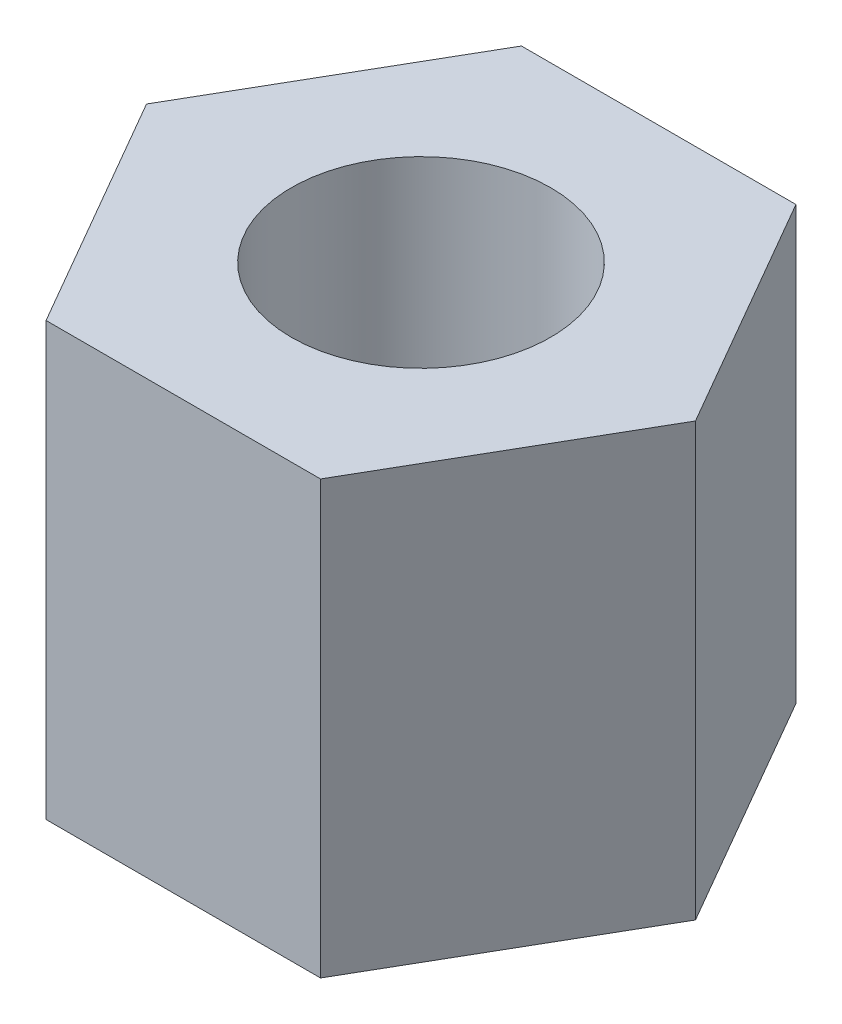
ISO-10303-21;
HEADER;
FILE_DESCRIPTION(('STEP AP214'),'2;1');
FILE_NAME('part.step','',(''),(''),'','','');
FILE_SCHEMA(('AUTOMOTIVE_DESIGN { 1 0 10303 214 1 1 1 1 }'));
ENDSEC;
DATA;
#1=APPLICATION_CONTEXT('core data for automotive mechanical design processes');
#2=APPLICATION_PROTOCOL_DEFINITION('international standard','automotive_design',2000,#1);
#3=PRODUCT_CONTEXT('',#1,'mechanical');
#4=PRODUCT('Part','Part','',(#3));
#5=PRODUCT_RELATED_PRODUCT_CATEGORY('part','',(#4));
#6=PRODUCT_DEFINITION_FORMATION('','',#4);
#7=PRODUCT_DEFINITION_CONTEXT('part definition',#1,'design');
#8=PRODUCT_DEFINITION('design','',#6,#7);
#9=PRODUCT_DEFINITION_SHAPE('','',#8);
#10=(LENGTH_UNIT() NAMED_UNIT(*) SI_UNIT(.MILLI.,.METRE.));
#11=(NAMED_UNIT(*) PLANE_ANGLE_UNIT() SI_UNIT($,.RADIAN.));
#12=(NAMED_UNIT(*) SI_UNIT($,.STERADIAN.) SOLID_ANGLE_UNIT());
#13=UNCERTAINTY_MEASURE_WITH_UNIT(LENGTH_MEASURE(1.E-05),#10,'distance_accuracy_value','');
#14=(GEOMETRIC_REPRESENTATION_CONTEXT(3) GLOBAL_UNCERTAINTY_ASSIGNED_CONTEXT((#13)) GLOBAL_UNIT_ASSIGNED_CONTEXT((#10,
#11,#12)) REPRESENTATION_CONTEXT('',''));
#15=CARTESIAN_POINT('',(0.,0.,0.));
#16=DIRECTION('',(0.,0.,1.));
#17=DIRECTION('',(1.,0.,0.));
#18=AXIS2_PLACEMENT_3D('',#15,#16,#17);
#19=CARTESIAN_POINT('',(0.,5.,0.));
#20=DIRECTION('',(0.,1.,0.));
#21=DIRECTION('',(0.,0.,1.));
#22=AXIS2_PLACEMENT_3D('',#19,#20,#21);
#23=PLANE('',#22);
#24=DIRECTION('',(-0.5,0.,-0.866025403784438));
#25=VECTOR('',#24,1.);
#26=CARTESIAN_POINT('',(3.17542648054294,5.,0.));
#27=LINE('',#26,#25);
#28=CARTESIAN_POINT('',(3.17542648054294,5.,0.));
#29=VERTEX_POINT('',#28);
#30=CARTESIAN_POINT('',(1.58771324027147,5.,-2.75));
#31=VERTEX_POINT('',#30);
#32=EDGE_CURVE('E128',#29,#31,#27,.T.);
#33=ORIENTED_EDGE('',*,*,#32,.T.);
#34=DIRECTION('',(-1.,0.,0.));
#35=VECTOR('',#34,1.);
#36=CARTESIAN_POINT('',(1.58771324027147,5.,-2.75));
#37=LINE('',#36,#35);
#38=CARTESIAN_POINT('',(-1.58771324027147,5.,-2.75));
#39=VERTEX_POINT('',#38);
#40=EDGE_CURVE('E86',#31,#39,#37,.T.);
#41=ORIENTED_EDGE('',*,*,#40,.T.);
#42=DIRECTION('',(-0.5,0.,0.866025403784439));
#43=VECTOR('',#42,1.);
#44=CARTESIAN_POINT('',(-1.58771324027147,5.,-2.75));
#45=LINE('',#44,#43);
#46=CARTESIAN_POINT('',(-3.17542648054294,5.,0.));
#47=VERTEX_POINT('',#46);
#48=EDGE_CURVE('E99',#39,#47,#45,.T.);
#49=ORIENTED_EDGE('',*,*,#48,.T.);
#50=DIRECTION('',(0.5,0.,0.866025403784439));
#51=VECTOR('',#50,1.);
#52=CARTESIAN_POINT('',(-3.17542648054294,5.,0.));
#53=LINE('',#52,#51);
#54=CARTESIAN_POINT('',(-1.58771324027147,5.,2.75));
#55=VERTEX_POINT('',#54);
#56=EDGE_CURVE('E93',#47,#55,#53,.T.);
#57=ORIENTED_EDGE('',*,*,#56,.T.);
#58=DIRECTION('',(1.,0.,0.));
#59=VECTOR('',#58,1.);
#60=CARTESIAN_POINT('',(-1.58771324027147,5.,2.75));
#61=LINE('',#60,#59);
#62=CARTESIAN_POINT('',(1.58771324027147,5.,2.75));
#63=VERTEX_POINT('',#62);
#64=EDGE_CURVE('E97',#55,#63,#61,.T.);
#65=ORIENTED_EDGE('',*,*,#64,.T.);
#66=DIRECTION('',(0.5,0.,-0.866025403784439));
#67=VECTOR('',#66,1.);
#68=CARTESIAN_POINT('',(1.58771324027147,5.,2.75));
#69=LINE('',#68,#67);
#70=EDGE_CURVE('E49',#63,#29,#69,.T.);
#71=ORIENTED_EDGE('',*,*,#70,.T.);
#72=EDGE_LOOP('',(#33,#41,#49,#57,#65,#71));
#73=FACE_BOUND('',#72,.T.);
#74=CARTESIAN_POINT('',(0.,5.,0.));
#75=DIRECTION('',(0.,1.,0.));
#76=DIRECTION('',(0.,0.,1.));
#77=AXIS2_PLACEMENT_3D('',#74,#75,#76);
#78=CIRCLE('',#77,1.5);
#79=CARTESIAN_POINT('',(0.,5.,1.5));
#80=VERTEX_POINT('',#79);
#81=EDGE_CURVE('E121',#80,#80,#78,.T.);
#82=ORIENTED_EDGE('',*,*,#81,.F.);
#83=EDGE_LOOP('',(#82));
#84=FACE_BOUND('',#83,.T.);
#85=ADVANCED_FACE('F32',(#73,#84),#23,.T.);
#86=CARTESIAN_POINT('',(0.,0.,0.));
#87=DIRECTION('',(0.,1.,0.));
#88=DIRECTION('',(0.,0.,1.));
#89=AXIS2_PLACEMENT_3D('',#86,#87,#88);
#90=PLANE('',#89);
#91=DIRECTION('',(-0.5,0.,-0.866025403784438));
#92=VECTOR('',#91,1.);
#93=CARTESIAN_POINT('',(3.17542648054294,0.,0.));
#94=LINE('',#93,#92);
#95=CARTESIAN_POINT('',(3.17542648054294,0.,0.));
#96=VERTEX_POINT('',#95);
#97=CARTESIAN_POINT('',(1.58771324027147,0.,-2.75));
#98=VERTEX_POINT('',#97);
#99=EDGE_CURVE('E117',#96,#98,#94,.T.);
#100=ORIENTED_EDGE('',*,*,#99,.F.);
#101=DIRECTION('',(0.5,0.,-0.866025403784439));
#102=VECTOR('',#101,1.);
#103=CARTESIAN_POINT('',(1.58771324027147,0.,2.75));
#104=LINE('',#103,#102);
#105=CARTESIAN_POINT('',(1.58771324027147,0.,2.75));
#106=VERTEX_POINT('',#105);
#107=EDGE_CURVE('E78',#106,#96,#104,.T.);
#108=ORIENTED_EDGE('',*,*,#107,.F.);
#109=DIRECTION('',(1.,0.,0.));
#110=VECTOR('',#109,1.);
#111=CARTESIAN_POINT('',(-1.58771324027147,0.,2.75));
#112=LINE('',#111,#110);
#113=CARTESIAN_POINT('',(-1.58771324027147,0.,2.75));
#114=VERTEX_POINT('',#113);
#115=EDGE_CURVE('E72',#114,#106,#112,.T.);
#116=ORIENTED_EDGE('',*,*,#115,.F.);
#117=DIRECTION('',(0.5,0.,0.866025403784439));
#118=VECTOR('',#117,1.);
#119=CARTESIAN_POINT('',(-3.17542648054294,0.,0.));
#120=LINE('',#119,#118);
#121=CARTESIAN_POINT('',(-3.17542648054294,0.,0.));
#122=VERTEX_POINT('',#121);
#123=EDGE_CURVE('E107',#122,#114,#120,.T.);
#124=ORIENTED_EDGE('',*,*,#123,.F.);
#125=DIRECTION('',(-0.5,0.,0.866025403784439));
#126=VECTOR('',#125,1.);
#127=CARTESIAN_POINT('',(-1.58771324027147,0.,-2.75));
#128=LINE('',#127,#126);
#129=CARTESIAN_POINT('',(-1.58771324027147,0.,-2.75));
#130=VERTEX_POINT('',#129);
#131=EDGE_CURVE('E123',#130,#122,#128,.T.);
#132=ORIENTED_EDGE('',*,*,#131,.F.);
#133=DIRECTION('',(-1.,0.,0.));
#134=VECTOR('',#133,1.);
#135=CARTESIAN_POINT('',(1.58771324027147,0.,-2.75));
#136=LINE('',#135,#134);
#137=EDGE_CURVE('E120',#98,#130,#136,.T.);
#138=ORIENTED_EDGE('',*,*,#137,.F.);
#139=EDGE_LOOP('',(#100,#108,#116,#124,#132,#138));
#140=FACE_BOUND('',#139,.T.);
#141=CARTESIAN_POINT('',(0.,0.,0.));
#142=DIRECTION('',(0.,1.,0.));
#143=DIRECTION('',(0.,0.,1.));
#144=AXIS2_PLACEMENT_3D('',#141,#142,#143);
#145=CIRCLE('',#144,1.5);
#146=CARTESIAN_POINT('',(0.,0.,1.5));
#147=VERTEX_POINT('',#146);
#148=EDGE_CURVE('E221',#147,#147,#145,.T.);
#149=ORIENTED_EDGE('',*,*,#148,.T.);
#150=EDGE_LOOP('',(#149));
#151=FACE_BOUND('',#150,.T.);
#152=ADVANCED_FACE('F137',(#140,#151),#90,.F.);
#153=CARTESIAN_POINT('',(3.17542648054294,5.,0.));
#154=DIRECTION('',(-0.866025403784439,0.,0.5));
#155=DIRECTION('',(0.5,0.,0.866025403784439));
#156=AXIS2_PLACEMENT_3D('',#153,#154,#155);
#157=PLANE('',#156);
#158=ORIENTED_EDGE('',*,*,#99,.T.);
#159=DIRECTION('',(0.,-1.,0.));
#160=VECTOR('',#159,1.);
#161=CARTESIAN_POINT('',(1.58771324027147,5.,-2.75));
#162=LINE('',#161,#160);
#163=EDGE_CURVE('E11',#31,#98,#162,.T.);
#164=ORIENTED_EDGE('',*,*,#163,.F.);
#165=ORIENTED_EDGE('',*,*,#32,.F.);
#166=DIRECTION('',(0.,-1.,0.));
#167=VECTOR('',#166,1.);
#168=CARTESIAN_POINT('',(3.17542648054294,5.,0.));
#169=LINE('',#168,#167);
#170=EDGE_CURVE('E113',#29,#96,#169,.T.);
#171=ORIENTED_EDGE('',*,*,#170,.T.);
#172=EDGE_LOOP('',(#158,#164,#165,#171));
#173=FACE_BOUND('',#172,.T.);
#174=ADVANCED_FACE('F34',(#173),#157,.F.);
#175=CARTESIAN_POINT('',(1.58771324027147,5.,-2.75));
#176=DIRECTION('',(0.,0.,1.));
#177=DIRECTION('',(1.,0.,0.));
#178=AXIS2_PLACEMENT_3D('',#175,#176,#177);
#179=PLANE('',#178);
#180=ORIENTED_EDGE('',*,*,#137,.T.);
#181=DIRECTION('',(0.,-1.,0.));
#182=VECTOR('',#181,1.);
#183=CARTESIAN_POINT('',(-1.58771324027147,5.,-2.75));
#184=LINE('',#183,#182);
#185=EDGE_CURVE('E41',#39,#130,#184,.T.);
#186=ORIENTED_EDGE('',*,*,#185,.F.);
#187=ORIENTED_EDGE('',*,*,#40,.F.);
#188=ORIENTED_EDGE('',*,*,#163,.T.);
#189=EDGE_LOOP('',(#180,#186,#187,#188));
#190=FACE_BOUND('',#189,.T.);
#191=ADVANCED_FACE('F162',(#190),#179,.F.);
#192=CARTESIAN_POINT('',(-1.58771324027147,5.,-2.75));
#193=DIRECTION('',(0.866025403784439,0.,0.5));
#194=DIRECTION('',(0.5,0.,-0.866025403784439));
#195=AXIS2_PLACEMENT_3D('',#192,#193,#194);
#196=PLANE('',#195);
#197=ORIENTED_EDGE('',*,*,#131,.T.);
#198=DIRECTION('',(0.,-1.,0.));
#199=VECTOR('',#198,1.);
#200=CARTESIAN_POINT('',(-3.17542648054294,5.,0.));
#201=LINE('',#200,#199);
#202=EDGE_CURVE('E108',#47,#122,#201,.T.);
#203=ORIENTED_EDGE('',*,*,#202,.F.);
#204=ORIENTED_EDGE('',*,*,#48,.F.);
#205=ORIENTED_EDGE('',*,*,#185,.T.);
#206=EDGE_LOOP('',(#197,#203,#204,#205));
#207=FACE_BOUND('',#206,.T.);
#208=ADVANCED_FACE('F134',(#207),#196,.F.);
#209=CARTESIAN_POINT('',(-3.17542648054294,5.,0.));
#210=DIRECTION('',(0.866025403784439,0.,-0.5));
#211=DIRECTION('',(-0.5,0.,-0.866025403784439));
#212=AXIS2_PLACEMENT_3D('',#209,#210,#211);
#213=PLANE('',#212);
#214=ORIENTED_EDGE('',*,*,#123,.T.);
#215=DIRECTION('',(0.,-1.,0.));
#216=VECTOR('',#215,1.);
#217=CARTESIAN_POINT('',(-1.58771324027147,5.,2.75));
#218=LINE('',#217,#216);
#219=EDGE_CURVE('E104',#55,#114,#218,.T.);
#220=ORIENTED_EDGE('',*,*,#219,.F.);
#221=ORIENTED_EDGE('',*,*,#56,.F.);
#222=ORIENTED_EDGE('',*,*,#202,.T.);
#223=EDGE_LOOP('',(#214,#220,#221,#222));
#224=FACE_BOUND('',#223,.T.);
#225=ADVANCED_FACE('F105',(#224),#213,.F.);
#226=CARTESIAN_POINT('',(-1.58771324027147,5.,2.75));
#227=DIRECTION('',(0.,0.,-1.));
#228=DIRECTION('',(-1.,0.,0.));
#229=AXIS2_PLACEMENT_3D('',#226,#227,#228);
#230=PLANE('',#229);
#231=ORIENTED_EDGE('',*,*,#115,.T.);
#232=DIRECTION('',(0.,-1.,0.));
#233=VECTOR('',#232,1.);
#234=CARTESIAN_POINT('',(1.58771324027147,5.,2.75));
#235=LINE('',#234,#233);
#236=EDGE_CURVE('E109',#63,#106,#235,.T.);
#237=ORIENTED_EDGE('',*,*,#236,.F.);
#238=ORIENTED_EDGE('',*,*,#64,.F.);
#239=ORIENTED_EDGE('',*,*,#219,.T.);
#240=EDGE_LOOP('',(#231,#237,#238,#239));
#241=FACE_BOUND('',#240,.T.);
#242=ADVANCED_FACE('F111',(#241),#230,.F.);
#243=CARTESIAN_POINT('',(1.58771324027147,5.,2.75));
#244=DIRECTION('',(-0.866025403784439,0.,-0.5));
#245=DIRECTION('',(-0.5,0.,0.866025403784439));
#246=AXIS2_PLACEMENT_3D('',#243,#244,#245);
#247=PLANE('',#246);
#248=ORIENTED_EDGE('',*,*,#107,.T.);
#249=ORIENTED_EDGE('',*,*,#170,.F.);
#250=ORIENTED_EDGE('',*,*,#70,.F.);
#251=ORIENTED_EDGE('',*,*,#236,.T.);
#252=EDGE_LOOP('',(#248,#249,#250,#251));
#253=FACE_BOUND('',#252,.T.);
#254=ADVANCED_FACE('F142',(#253),#247,.F.);
#255=CARTESIAN_POINT('',(0.,5.,0.));
#256=DIRECTION('',(0.,-1.,0.));
#257=DIRECTION('',(0.,0.,-1.));
#258=AXIS2_PLACEMENT_3D('',#255,#256,#257);
#259=CYLINDRICAL_SURFACE('',#258,1.5);
#260=ORIENTED_EDGE('',*,*,#81,.T.);
#261=EDGE_LOOP('',(#260));
#262=FACE_BOUND('',#261,.T.);
#263=ORIENTED_EDGE('',*,*,#148,.F.);
#264=EDGE_LOOP('',(#263));
#265=FACE_BOUND('',#264,.T.);
#266=ADVANCED_FACE('F144',(#262,#265),#259,.F.);
#267=CLOSED_SHELL('',(#85,#152,#174,#191,#208,#225,#242,#254,#266));
#268=MANIFOLD_SOLID_BREP('B2',#267);
#269=ADVANCED_BREP_SHAPE_REPRESENTATION('',(#18,#268),#14);
#270=SHAPE_DEFINITION_REPRESENTATION(#9,#269);
ENDSEC;
END-ISO-10303-21;
